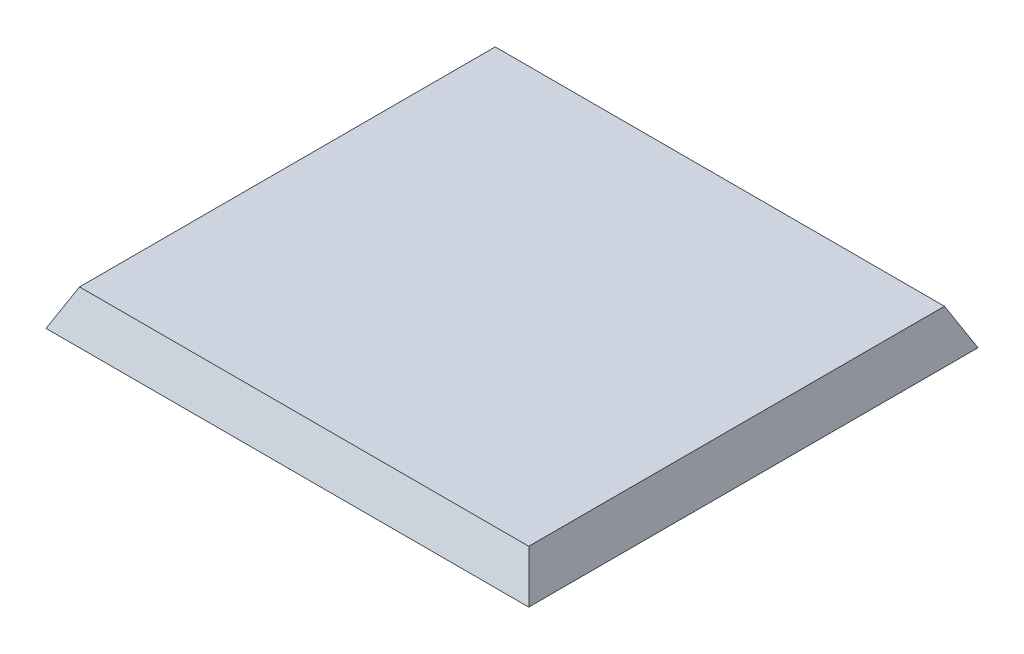
ISO-10303-21;
HEADER;
FILE_DESCRIPTION(('STEP AP214'),'2;1');
FILE_NAME('part.step','',(''),(''),'','','');
FILE_SCHEMA(('AUTOMOTIVE_DESIGN { 1 0 10303 214 1 1 1 1 }'));
ENDSEC;
DATA;
#1=APPLICATION_CONTEXT('core data for automotive mechanical design processes');
#2=APPLICATION_PROTOCOL_DEFINITION('international standard','automotive_design',2000,#1);
#3=PRODUCT_CONTEXT('',#1,'mechanical');
#4=PRODUCT('Part','Part','',(#3));
#5=PRODUCT_RELATED_PRODUCT_CATEGORY('part','',(#4));
#6=PRODUCT_DEFINITION_FORMATION('','',#4);
#7=PRODUCT_DEFINITION_CONTEXT('part definition',#1,'design');
#8=PRODUCT_DEFINITION('design','',#6,#7);
#9=PRODUCT_DEFINITION_SHAPE('','',#8);
#10=(LENGTH_UNIT() NAMED_UNIT(*) SI_UNIT(.MILLI.,.METRE.));
#11=(NAMED_UNIT(*) PLANE_ANGLE_UNIT() SI_UNIT($,.RADIAN.));
#12=(NAMED_UNIT(*) SI_UNIT($,.STERADIAN.) SOLID_ANGLE_UNIT());
#13=UNCERTAINTY_MEASURE_WITH_UNIT(LENGTH_MEASURE(1.E-05),#10,'distance_accuracy_value','');
#14=(GEOMETRIC_REPRESENTATION_CONTEXT(3) GLOBAL_UNCERTAINTY_ASSIGNED_CONTEXT((#13)) GLOBAL_UNIT_ASSIGNED_CONTEXT((#10,
#11,#12)) REPRESENTATION_CONTEXT('',''));
#15=CARTESIAN_POINT('',(0.,0.,0.));
#16=DIRECTION('',(0.,0.,1.));
#17=DIRECTION('',(1.,0.,0.));
#18=AXIS2_PLACEMENT_3D('',#15,#16,#17);
#19=CARTESIAN_POINT('',(4.068,3.4256,1.9852));
#20=DIRECTION('',(-0.90630778703665,0.4226182617407,0.));
#21=DIRECTION('',(-0.4226182617407,-0.90630778703665,0.));
#22=AXIS2_PLACEMENT_3D('',#19,#20,#21);
#23=PLANE('',#22);
#24=DIRECTION('',(0.,0.,1.));
#25=VECTOR('',#24,1.);
#26=CARTESIAN_POINT('',(4.0493476936738,3.3856,1.9852));
#27=LINE('',#26,#25);
#28=CARTESIAN_POINT('',(4.0493476936738,3.3856,1.9852));
#29=VERTEX_POINT('',#28);
#30=CARTESIAN_POINT('',(4.0493476936738,3.3856,2.4852));
#31=VERTEX_POINT('',#30);
#32=EDGE_CURVE('E11',#29,#31,#27,.T.);
#33=ORIENTED_EDGE('',*,*,#32,.T.);
#34=DIRECTION('',(-0.389281620635026,-0.834817129478987,0.389281620635026));
#35=VECTOR('',#34,1.);
#36=CARTESIAN_POINT('',(4.090059312576,3.4729063484809,2.4444883810978));
#37=LINE('',#36,#35);
#38=CARTESIAN_POINT('',(4.068,3.4256,2.4665476936738));
#39=VERTEX_POINT('',#38);
#40=EDGE_CURVE('E24',#39,#31,#37,.T.);
#41=ORIENTED_EDGE('',*,*,#40,.F.);
#42=DIRECTION('',(0.,0.,1.));
#43=VECTOR('',#42,1.);
#44=CARTESIAN_POINT('',(4.068,3.4256,1.9852));
#45=LINE('',#44,#43);
#46=CARTESIAN_POINT('',(4.068,3.4256,2.0038523063262));
#47=VERTEX_POINT('',#46);
#48=EDGE_CURVE('E88',#47,#39,#45,.T.);
#49=ORIENTED_EDGE('',*,*,#48,.F.);
#50=DIRECTION('',(-0.389281620635026,-0.834817129478987,-0.389281620635026));
#51=VECTOR('',#50,1.);
#52=CARTESIAN_POINT('',(4.0651734261389,3.4195383927934,2.001025732465));
#53=LINE('',#52,#51);
#54=EDGE_CURVE('E77',#47,#29,#53,.T.);
#55=ORIENTED_EDGE('',*,*,#54,.T.);
#56=EDGE_LOOP('',(#33,#41,#49,#55));
#57=FACE_BOUND('',#56,.T.);
#58=ADVANCED_FACE('F17',(#57),#23,.T.);
#59=CARTESIAN_POINT('',(4.318,3.3856,2.4852));
#60=DIRECTION('',(0.,0.4226182617407,0.90630778703665));
#61=DIRECTION('',(0.,-0.90630778703665,0.4226182617407));
#62=AXIS2_PLACEMENT_3D('',#59,#60,#61);
#63=PLANE('',#62);
#64=DIRECTION('',(1.,0.,0.));
#65=VECTOR('',#64,1.);
#66=CARTESIAN_POINT('',(4.318,3.3856,2.4852));
#67=LINE('',#66,#65);
#68=CARTESIAN_POINT('',(4.5866523063262,3.3856,2.4852));
#69=VERTEX_POINT('',#68);
#70=EDGE_CURVE('E85',#31,#69,#67,.T.);
#71=ORIENTED_EDGE('',*,*,#70,.T.);
#72=DIRECTION('',(0.389281620635026,-0.834817129478987,0.389281620635026));
#73=VECTOR('',#72,1.);
#74=CARTESIAN_POINT('',(4.495056483779,3.5820278753422,2.3936041774528));
#75=LINE('',#74,#73);
#76=CARTESIAN_POINT('',(4.568,3.4256,2.4665476936738));
#77=VERTEX_POINT('',#76);
#78=EDGE_CURVE('E83',#77,#69,#75,.T.);
#79=ORIENTED_EDGE('',*,*,#78,.F.);
#80=DIRECTION('',(1.,0.,0.));
#81=VECTOR('',#80,1.);
#82=CARTESIAN_POINT('',(4.318,3.4256,2.4665476936738));
#83=LINE('',#82,#81);
#84=EDGE_CURVE('E72',#39,#77,#83,.T.);
#85=ORIENTED_EDGE('',*,*,#84,.F.);
#86=ORIENTED_EDGE('',*,*,#40,.T.);
#87=EDGE_LOOP('',(#71,#79,#85,#86));
#88=FACE_BOUND('',#87,.T.);
#89=ADVANCED_FACE('F90',(#88),#63,.T.);
#90=CARTESIAN_POINT('',(4.568,3.4256,1.9852));
#91=DIRECTION('',(0.90630778703665,0.4226182617407,0.));
#92=DIRECTION('',(-0.4226182617407,0.90630778703665,0.));
#93=AXIS2_PLACEMENT_3D('',#90,#91,#92);
#94=PLANE('',#93);
#95=DIRECTION('',(0.,0.,-1.));
#96=VECTOR('',#95,1.);
#97=CARTESIAN_POINT('',(4.5866523063262,3.3856,1.9852));
#98=LINE('',#97,#96);
#99=CARTESIAN_POINT('',(4.5866523063262,3.3856,1.9852));
#100=VERTEX_POINT('',#99);
#101=EDGE_CURVE('E60',#69,#100,#98,.T.);
#102=ORIENTED_EDGE('',*,*,#101,.T.);
#103=DIRECTION('',(0.389281620635026,-0.834817129478987,-0.389281620635026));
#104=VECTOR('',#103,1.);
#105=CARTESIAN_POINT('',(4.545940687424,3.4729063484809,2.0259116189022));
#106=LINE('',#105,#104);
#107=CARTESIAN_POINT('',(4.568,3.4256,2.0038523063262));
#108=VERTEX_POINT('',#107);
#109=EDGE_CURVE('E54',#108,#100,#106,.T.);
#110=ORIENTED_EDGE('',*,*,#109,.F.);
#111=DIRECTION('',(0.,0.,-1.));
#112=VECTOR('',#111,1.);
#113=CARTESIAN_POINT('',(4.568,3.4256,1.9852));
#114=LINE('',#113,#112);
#115=EDGE_CURVE('E58',#77,#108,#114,.T.);
#116=ORIENTED_EDGE('',*,*,#115,.F.);
#117=ORIENTED_EDGE('',*,*,#78,.T.);
#118=EDGE_LOOP('',(#102,#110,#116,#117));
#119=FACE_BOUND('',#118,.T.);
#120=ADVANCED_FACE('F56',(#119),#94,.T.);
#121=CARTESIAN_POINT('',(4.318,3.3856,1.9852));
#122=DIRECTION('',(0.,0.4226182617407,-0.90630778703665));
#123=DIRECTION('',(0.,0.90630778703665,0.4226182617407));
#124=AXIS2_PLACEMENT_3D('',#121,#122,#123);
#125=PLANE('',#124);
#126=DIRECTION('',(-1.,0.,0.));
#127=VECTOR('',#126,1.);
#128=CARTESIAN_POINT('',(4.318,3.3856,1.9852));
#129=LINE('',#128,#127);
#130=EDGE_CURVE('E73',#100,#29,#129,.T.);
#131=ORIENTED_EDGE('',*,*,#130,.T.);
#132=ORIENTED_EDGE('',*,*,#54,.F.);
#133=DIRECTION('',(-1.,0.,0.));
#134=VECTOR('',#133,1.);
#135=CARTESIAN_POINT('',(4.318,3.4256,2.0038523063262));
#136=LINE('',#135,#134);
#137=EDGE_CURVE('E70',#108,#47,#136,.T.);
#138=ORIENTED_EDGE('',*,*,#137,.F.);
#139=ORIENTED_EDGE('',*,*,#109,.T.);
#140=EDGE_LOOP('',(#131,#132,#138,#139));
#141=FACE_BOUND('',#140,.T.);
#142=ADVANCED_FACE('F76',(#141),#125,.T.);
#143=CARTESIAN_POINT('',(4.318,3.4256,2.2352));
#144=DIRECTION('',(0.,1.,0.));
#145=DIRECTION('',(0.,0.,1.));
#146=AXIS2_PLACEMENT_3D('',#143,#144,#145);
#147=PLANE('',#146);
#148=ORIENTED_EDGE('',*,*,#48,.T.);
#149=ORIENTED_EDGE('',*,*,#84,.T.);
#150=ORIENTED_EDGE('',*,*,#115,.T.);
#151=ORIENTED_EDGE('',*,*,#137,.T.);
#152=EDGE_LOOP('',(#148,#149,#150,#151));
#153=FACE_BOUND('',#152,.T.);
#154=ADVANCED_FACE('F69',(#153),#147,.T.);
#155=CARTESIAN_POINT('',(4.318,3.3856,2.2352));
#156=DIRECTION('',(0.,1.,0.));
#157=DIRECTION('',(0.,0.,1.));
#158=AXIS2_PLACEMENT_3D('',#155,#156,#157);
#159=PLANE('',#158);
#160=ORIENTED_EDGE('',*,*,#32,.F.);
#161=ORIENTED_EDGE('',*,*,#130,.F.);
#162=ORIENTED_EDGE('',*,*,#101,.F.);
#163=ORIENTED_EDGE('',*,*,#70,.F.);
#164=EDGE_LOOP('',(#160,#161,#162,#163));
#165=FACE_BOUND('',#164,.T.);
#166=ADVANCED_FACE('F91',(#165),#159,.F.);
#167=CLOSED_SHELL('',(#58,#89,#120,#142,#154,#166));
#168=MANIFOLD_SOLID_BREP('B1',#167);
#169=ADVANCED_BREP_SHAPE_REPRESENTATION('',(#18,#168),#14);
#170=SHAPE_DEFINITION_REPRESENTATION(#9,#169);
ENDSEC;
END-ISO-10303-21;
